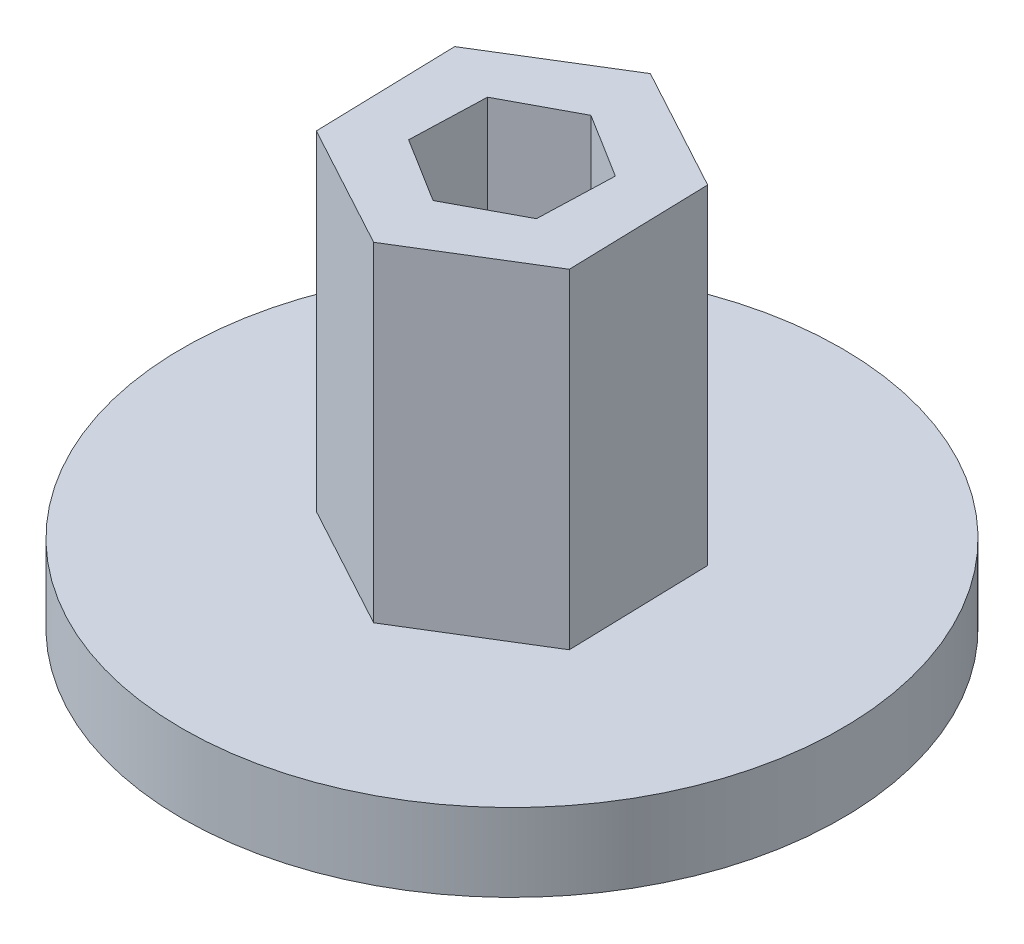
ISO-10303-21;
HEADER;
FILE_DESCRIPTION(('STEP AP214'),'2;1');
FILE_NAME('part.step','',(''),(''),'','','');
FILE_SCHEMA(('AUTOMOTIVE_DESIGN { 1 0 10303 214 1 1 1 1 }'));
ENDSEC;
DATA;
#1=APPLICATION_CONTEXT('core data for automotive mechanical design processes');
#2=APPLICATION_PROTOCOL_DEFINITION('international standard','automotive_design',2000,#1);
#3=PRODUCT_CONTEXT('',#1,'mechanical');
#4=PRODUCT('Part','Part','',(#3));
#5=PRODUCT_RELATED_PRODUCT_CATEGORY('part','',(#4));
#6=PRODUCT_DEFINITION_FORMATION('','',#4);
#7=PRODUCT_DEFINITION_CONTEXT('part definition',#1,'design');
#8=PRODUCT_DEFINITION('design','',#6,#7);
#9=PRODUCT_DEFINITION_SHAPE('','',#8);
#10=(LENGTH_UNIT() NAMED_UNIT(*) SI_UNIT(.MILLI.,.METRE.));
#11=(NAMED_UNIT(*) PLANE_ANGLE_UNIT() SI_UNIT($,.RADIAN.));
#12=(NAMED_UNIT(*) SI_UNIT($,.STERADIAN.) SOLID_ANGLE_UNIT());
#13=UNCERTAINTY_MEASURE_WITH_UNIT(LENGTH_MEASURE(1.E-05),#10,'distance_accuracy_value','');
#14=(GEOMETRIC_REPRESENTATION_CONTEXT(3) GLOBAL_UNCERTAINTY_ASSIGNED_CONTEXT((#13)) GLOBAL_UNIT_ASSIGNED_CONTEXT((#10,
#11,#12)) REPRESENTATION_CONTEXT('',''));
#15=CARTESIAN_POINT('',(0.,0.,0.));
#16=DIRECTION('',(0.,0.,1.));
#17=DIRECTION('',(1.,0.,0.));
#18=AXIS2_PLACEMENT_3D('',#15,#16,#17);
#19=CARTESIAN_POINT('',(0.,3.,0.));
#20=DIRECTION('',(0.,-1.,0.));
#21=DIRECTION('',(0.,0.,-1.));
#22=AXIS2_PLACEMENT_3D('',#19,#20,#21);
#23=CYLINDRICAL_SURFACE('',#22,12.7);
#24=CARTESIAN_POINT('',(0.,3.,0.));
#25=DIRECTION('',(0.,1.,0.));
#26=DIRECTION('',(0.,0.,1.));
#27=AXIS2_PLACEMENT_3D('',#24,#25,#26);
#28=CIRCLE('',#27,12.7);
#29=CARTESIAN_POINT('',(0.,3.,12.7));
#30=VERTEX_POINT('',#29);
#31=EDGE_CURVE('E11',#30,#30,#28,.T.);
#32=ORIENTED_EDGE('',*,*,#31,.F.);
#33=EDGE_LOOP('',(#32));
#34=FACE_BOUND('',#33,.T.);
#35=CARTESIAN_POINT('',(0.,0.,0.));
#36=DIRECTION('',(0.,1.,0.));
#37=DIRECTION('',(0.,0.,1.));
#38=AXIS2_PLACEMENT_3D('',#35,#36,#37);
#39=CIRCLE('',#38,12.7);
#40=CARTESIAN_POINT('',(0.,0.,12.7));
#41=VERTEX_POINT('',#40);
#42=EDGE_CURVE('E35',#41,#41,#39,.T.);
#43=ORIENTED_EDGE('',*,*,#42,.T.);
#44=EDGE_LOOP('',(#43));
#45=FACE_BOUND('',#44,.T.);
#46=ADVANCED_FACE('F32',(#34,#45),#23,.T.);
#47=CARTESIAN_POINT('',(0.,3.,0.));
#48=DIRECTION('',(0.,1.,0.));
#49=DIRECTION('',(0.,0.,1.));
#50=AXIS2_PLACEMENT_3D('',#47,#48,#49);
#51=PLANE('',#50);
#52=DIRECTION('',(0.879285702622515,0.,0.476294712508579));
#53=VECTOR('',#52,1.);
#54=CARTESIAN_POINT('',(-4.67137463720313,3.,2.86894178717555));
#55=LINE('',#54,#53);
#56=CARTESIAN_POINT('',(-4.67137463720313,3.,2.86894178717555));
#57=VERTEX_POINT('',#56);
#58=CARTESIAN_POINT('',(0.148889151071191,3.,5.48));
#59=VERTEX_POINT('',#58);
#60=EDGE_CURVE('E174',#57,#59,#55,.T.);
#61=ORIENTED_EDGE('',*,*,#60,.F.);
#62=DIRECTION('',(0.0271595305906223,0.,0.999631111909837));
#63=VECTOR('',#62,1.);
#64=CARTESIAN_POINT('',(-4.82026378827432,3.,-2.61105821282445));
#65=LINE('',#64,#63);
#66=CARTESIAN_POINT('',(-4.82026378827432,3.,-2.61105821282445));
#67=VERTEX_POINT('',#66);
#68=EDGE_CURVE('E179',#67,#57,#65,.T.);
#69=ORIENTED_EDGE('',*,*,#68,.F.);
#70=DIRECTION('',(-0.852126172031893,0.,0.523336399401258));
#71=VECTOR('',#70,1.);
#72=CARTESIAN_POINT('',(-0.148889151071195,3.,-5.48));
#73=LINE('',#72,#71);
#74=CARTESIAN_POINT('',(-0.148889151071195,3.,-5.48));
#75=VERTEX_POINT('',#74);
#76=EDGE_CURVE('E201',#75,#67,#73,.T.);
#77=ORIENTED_EDGE('',*,*,#76,.F.);
#78=DIRECTION('',(-0.879285702622515,0.,-0.476294712508579));
#79=VECTOR('',#78,1.);
#80=CARTESIAN_POINT('',(4.67137463720313,3.,-2.86894178717556));
#81=LINE('',#80,#79);
#82=CARTESIAN_POINT('',(4.67137463720313,3.,-2.86894178717556));
#83=VERTEX_POINT('',#82);
#84=EDGE_CURVE('E198',#83,#75,#81,.T.);
#85=ORIENTED_EDGE('',*,*,#84,.F.);
#86=DIRECTION('',(-0.0271595305906223,0.,-0.999631111909837));
#87=VECTOR('',#86,1.);
#88=CARTESIAN_POINT('',(4.82026378827432,3.,2.61105821282444));
#89=LINE('',#88,#87);
#90=CARTESIAN_POINT('',(4.82026378827432,3.,2.61105821282444));
#91=VERTEX_POINT('',#90);
#92=EDGE_CURVE('E195',#91,#83,#89,.T.);
#93=ORIENTED_EDGE('',*,*,#92,.F.);
#94=DIRECTION('',(0.852126172031893,0.,-0.523336399401258));
#95=VECTOR('',#94,1.);
#96=CARTESIAN_POINT('',(0.148889151071191,3.,5.48));
#97=LINE('',#96,#95);
#98=EDGE_CURVE('E192',#59,#91,#97,.T.);
#99=ORIENTED_EDGE('',*,*,#98,.F.);
#100=EDGE_LOOP('',(#61,#69,#77,#85,#93,#99));
#101=FACE_BOUND('',#100,.T.);
#102=ORIENTED_EDGE('',*,*,#31,.T.);
#103=EDGE_LOOP('',(#102));
#104=FACE_BOUND('',#103,.T.);
#105=ADVANCED_FACE('F231',(#101,#104),#51,.T.);
#106=CARTESIAN_POINT('',(0.,0.,0.));
#107=DIRECTION('',(0.,1.,0.));
#108=DIRECTION('',(0.,0.,1.));
#109=AXIS2_PLACEMENT_3D('',#106,#107,#108);
#110=PLANE('',#109);
#111=DIRECTION('',(-0.882282415438788,0.,0.470720447195039));
#112=VECTOR('',#111,1.);
#113=CARTESIAN_POINT('',(-1.20033714034735,0.,-2.24982015936891));
#114=LINE('',#113,#112);
#115=CARTESIAN_POINT('',(0.0985971342925371,0.,-2.94283513046676));
#116=VERTEX_POINT('',#115);
#117=CARTESIAN_POINT('',(-2.49927141498724,0.,-1.55680518827106));
#118=VERTEX_POINT('',#117);
#119=EDGE_CURVE('E168',#116,#118,#114,.T.);
#120=ORIENTED_EDGE('',*,*,#119,.T.);
#121=DIRECTION('',(-0.0334853423677184,0.,0.999439208679806));
#122=VECTOR('',#121,1.);
#123=CARTESIAN_POINT('',(-2.5485699821335,0.,-0.085387623037682));
#124=LINE('',#123,#122);
#125=CARTESIAN_POINT('',(-2.59786854927977,0.,1.3860299421957));
#126=VERTEX_POINT('',#125);
#127=EDGE_CURVE('E171',#118,#126,#124,.T.);
#128=ORIENTED_EDGE('',*,*,#127,.T.);
#129=DIRECTION('',(0.84879707307107,0.,0.528718761484766));
#130=VECTOR('',#129,1.);
#131=CARTESIAN_POINT('',(-1.34823284178615,0.,2.16443253633123));
#132=LINE('',#131,#130);
#133=CARTESIAN_POINT('',(-0.098597134292536,0.,2.94283513046676));
#134=VERTEX_POINT('',#133);
#135=EDGE_CURVE('E153',#126,#134,#132,.T.);
#136=ORIENTED_EDGE('',*,*,#135,.T.);
#137=DIRECTION('',(0.882282415438788,0.,-0.470720447195039));
#138=VECTOR('',#137,1.);
#139=CARTESIAN_POINT('',(1.20033714034735,0.,2.24982015936891));
#140=LINE('',#139,#138);
#141=CARTESIAN_POINT('',(2.49927141498724,0.,1.55680518827106));
#142=VERTEX_POINT('',#141);
#143=EDGE_CURVE('E126',#134,#142,#140,.T.);
#144=ORIENTED_EDGE('',*,*,#143,.T.);
#145=DIRECTION('',(0.0334853423677185,0.,-0.999439208679806));
#146=VECTOR('',#145,1.);
#147=CARTESIAN_POINT('',(2.54856998213351,0.,0.085387623037682));
#148=LINE('',#147,#146);
#149=CARTESIAN_POINT('',(2.59786854927977,0.,-1.3860299421957));
#150=VERTEX_POINT('',#149);
#151=EDGE_CURVE('E162',#142,#150,#148,.T.);
#152=ORIENTED_EDGE('',*,*,#151,.T.);
#153=DIRECTION('',(-0.848797073071069,0.,-0.528718761484767));
#154=VECTOR('',#153,1.);
#155=CARTESIAN_POINT('',(1.34823284178616,0.,-2.16443253633123));
#156=LINE('',#155,#154);
#157=EDGE_CURVE('E165',#150,#116,#156,.T.);
#158=ORIENTED_EDGE('',*,*,#157,.T.);
#159=EDGE_LOOP('',(#120,#128,#136,#144,#152,#158));
#160=FACE_BOUND('',#159,.T.);
#161=ORIENTED_EDGE('',*,*,#42,.F.);
#162=EDGE_LOOP('',(#161));
#163=FACE_BOUND('',#162,.T.);
#164=ADVANCED_FACE('F228',(#160,#163),#110,.F.);
#165=CARTESIAN_POINT('',(-4.67137463720313,15.7,2.86894178717555));
#166=DIRECTION('',(0.476294712508579,0.,-0.879285702622515));
#167=DIRECTION('',(-0.879285702622515,0.,-0.476294712508579));
#168=AXIS2_PLACEMENT_3D('',#165,#166,#167);
#169=PLANE('',#168);
#170=ORIENTED_EDGE('',*,*,#60,.T.);
#171=DIRECTION('',(0.,-1.,0.));
#172=VECTOR('',#171,1.);
#173=CARTESIAN_POINT('',(0.148889151071191,15.7,5.48));
#174=LINE('',#173,#172);
#175=CARTESIAN_POINT('',(0.148889151071191,15.7,5.48));
#176=VERTEX_POINT('',#175);
#177=EDGE_CURVE('E220',#176,#59,#174,.T.);
#178=ORIENTED_EDGE('',*,*,#177,.F.);
#179=DIRECTION('',(0.879285702622515,0.,0.476294712508579));
#180=VECTOR('',#179,1.);
#181=CARTESIAN_POINT('',(-4.67137463720313,15.7,2.86894178717555));
#182=LINE('',#181,#180);
#183=CARTESIAN_POINT('',(-4.67137463720313,15.7,2.86894178717555));
#184=VERTEX_POINT('',#183);
#185=EDGE_CURVE('E175',#184,#176,#182,.T.);
#186=ORIENTED_EDGE('',*,*,#185,.F.);
#187=DIRECTION('',(0.,-1.,0.));
#188=VECTOR('',#187,1.);
#189=CARTESIAN_POINT('',(-4.67137463720313,15.7,2.86894178717555));
#190=LINE('',#189,#188);
#191=EDGE_CURVE('E189',#184,#57,#190,.T.);
#192=ORIENTED_EDGE('',*,*,#191,.T.);
#193=EDGE_LOOP('',(#170,#178,#186,#192));
#194=FACE_BOUND('',#193,.T.);
#195=ADVANCED_FACE('F230',(#194),#169,.F.);
#196=CARTESIAN_POINT('',(0.148889151071191,15.7,5.48));
#197=DIRECTION('',(-0.523336399401258,0.,-0.852126172031893));
#198=DIRECTION('',(-0.852126172031893,0.,0.523336399401258));
#199=AXIS2_PLACEMENT_3D('',#196,#197,#198);
#200=PLANE('',#199);
#201=ORIENTED_EDGE('',*,*,#98,.T.);
#202=DIRECTION('',(0.,-1.,0.));
#203=VECTOR('',#202,1.);
#204=CARTESIAN_POINT('',(4.82026378827432,15.7,2.61105821282444));
#205=LINE('',#204,#203);
#206=CARTESIAN_POINT('',(4.82026378827432,15.7,2.61105821282444));
#207=VERTEX_POINT('',#206);
#208=EDGE_CURVE('E217',#207,#91,#205,.T.);
#209=ORIENTED_EDGE('',*,*,#208,.F.);
#210=DIRECTION('',(0.852126172031893,0.,-0.523336399401258));
#211=VECTOR('',#210,1.);
#212=CARTESIAN_POINT('',(0.148889151071191,15.7,5.48));
#213=LINE('',#212,#211);
#214=EDGE_CURVE('E178',#176,#207,#213,.T.);
#215=ORIENTED_EDGE('',*,*,#214,.F.);
#216=ORIENTED_EDGE('',*,*,#177,.T.);
#217=EDGE_LOOP('',(#201,#209,#215,#216));
#218=FACE_BOUND('',#217,.T.);
#219=ADVANCED_FACE('F237',(#218),#200,.F.);
#220=CARTESIAN_POINT('',(4.82026378827432,15.7,2.61105821282444));
#221=DIRECTION('',(-0.999631111909837,0.,0.0271595305906223));
#222=DIRECTION('',(0.0271595305906223,0.,0.999631111909837));
#223=AXIS2_PLACEMENT_3D('',#220,#221,#222);
#224=PLANE('',#223);
#225=ORIENTED_EDGE('',*,*,#92,.T.);
#226=DIRECTION('',(0.,-1.,0.));
#227=VECTOR('',#226,1.);
#228=CARTESIAN_POINT('',(4.67137463720313,15.7,-2.86894178717556));
#229=LINE('',#228,#227);
#230=CARTESIAN_POINT('',(4.67137463720313,15.7,-2.86894178717556));
#231=VERTEX_POINT('',#230);
#232=EDGE_CURVE('E214',#231,#83,#229,.T.);
#233=ORIENTED_EDGE('',*,*,#232,.F.);
#234=DIRECTION('',(-0.0271595305906223,0.,-0.999631111909837));
#235=VECTOR('',#234,1.);
#236=CARTESIAN_POINT('',(4.82026378827432,15.7,2.61105821282444));
#237=LINE('',#236,#235);
#238=EDGE_CURVE('E181',#207,#231,#237,.T.);
#239=ORIENTED_EDGE('',*,*,#238,.F.);
#240=ORIENTED_EDGE('',*,*,#208,.T.);
#241=EDGE_LOOP('',(#225,#233,#239,#240));
#242=FACE_BOUND('',#241,.T.);
#243=ADVANCED_FACE('F268',(#242),#224,.F.);
#244=CARTESIAN_POINT('',(4.67137463720313,15.7,-2.86894178717556));
#245=DIRECTION('',(-0.476294712508579,0.,0.879285702622515));
#246=DIRECTION('',(0.879285702622515,0.,0.476294712508579));
#247=AXIS2_PLACEMENT_3D('',#244,#245,#246);
#248=PLANE('',#247);
#249=ORIENTED_EDGE('',*,*,#84,.T.);
#250=DIRECTION('',(0.,-1.,0.));
#251=VECTOR('',#250,1.);
#252=CARTESIAN_POINT('',(-0.148889151071195,15.7,-5.48));
#253=LINE('',#252,#251);
#254=CARTESIAN_POINT('',(-0.148889151071195,15.7,-5.48));
#255=VERTEX_POINT('',#254);
#256=EDGE_CURVE('E211',#255,#75,#253,.T.);
#257=ORIENTED_EDGE('',*,*,#256,.F.);
#258=DIRECTION('',(-0.879285702622515,0.,-0.476294712508579));
#259=VECTOR('',#258,1.);
#260=CARTESIAN_POINT('',(4.67137463720313,15.7,-2.86894178717556));
#261=LINE('',#260,#259);
#262=EDGE_CURVE('E183',#231,#255,#261,.T.);
#263=ORIENTED_EDGE('',*,*,#262,.F.);
#264=ORIENTED_EDGE('',*,*,#232,.T.);
#265=EDGE_LOOP('',(#249,#257,#263,#264));
#266=FACE_BOUND('',#265,.T.);
#267=ADVANCED_FACE('F277',(#266),#248,.F.);
#268=CARTESIAN_POINT('',(-0.148889151071195,15.7,-5.48));
#269=DIRECTION('',(0.523336399401258,0.,0.852126172031893));
#270=DIRECTION('',(0.852126172031893,0.,-0.523336399401258));
#271=AXIS2_PLACEMENT_3D('',#268,#269,#270);
#272=PLANE('',#271);
#273=ORIENTED_EDGE('',*,*,#76,.T.);
#274=DIRECTION('',(0.,-1.,0.));
#275=VECTOR('',#274,1.);
#276=CARTESIAN_POINT('',(-4.82026378827432,15.7,-2.61105821282445));
#277=LINE('',#276,#275);
#278=CARTESIAN_POINT('',(-4.82026378827432,15.7,-2.61105821282445));
#279=VERTEX_POINT('',#278);
#280=EDGE_CURVE('E208',#279,#67,#277,.T.);
#281=ORIENTED_EDGE('',*,*,#280,.F.);
#282=DIRECTION('',(-0.852126172031893,0.,0.523336399401258));
#283=VECTOR('',#282,1.);
#284=CARTESIAN_POINT('',(-0.148889151071195,15.7,-5.48));
#285=LINE('',#284,#283);
#286=EDGE_CURVE('E185',#255,#279,#285,.T.);
#287=ORIENTED_EDGE('',*,*,#286,.F.);
#288=ORIENTED_EDGE('',*,*,#256,.T.);
#289=EDGE_LOOP('',(#273,#281,#287,#288));
#290=FACE_BOUND('',#289,.T.);
#291=ADVANCED_FACE('F287',(#290),#272,.F.);
#292=CARTESIAN_POINT('',(-4.82026378827432,15.7,-2.61105821282445));
#293=DIRECTION('',(0.999631111909837,0.,-0.0271595305906223));
#294=DIRECTION('',(-0.0271595305906223,0.,-0.999631111909837));
#295=AXIS2_PLACEMENT_3D('',#292,#293,#294);
#296=PLANE('',#295);
#297=ORIENTED_EDGE('',*,*,#68,.T.);
#298=ORIENTED_EDGE('',*,*,#191,.F.);
#299=DIRECTION('',(0.0271595305906223,0.,0.999631111909837));
#300=VECTOR('',#299,1.);
#301=CARTESIAN_POINT('',(-4.82026378827432,15.7,-2.61105821282445));
#302=LINE('',#301,#300);
#303=EDGE_CURVE('E187',#279,#184,#302,.T.);
#304=ORIENTED_EDGE('',*,*,#303,.F.);
#305=ORIENTED_EDGE('',*,*,#280,.T.);
#306=EDGE_LOOP('',(#297,#298,#304,#305));
#307=FACE_BOUND('',#306,.T.);
#308=ADVANCED_FACE('F297',(#307),#296,.F.);
#309=CARTESIAN_POINT('',(0.,15.7,0.));
#310=DIRECTION('',(0.,1.,0.));
#311=DIRECTION('',(0.,0.,1.));
#312=AXIS2_PLACEMENT_3D('',#309,#310,#311);
#313=PLANE('',#312);
#314=DIRECTION('',(-0.0334853423677184,0.,0.999439208679806));
#315=VECTOR('',#314,1.);
#316=CARTESIAN_POINT('',(-2.49927141498724,15.7,-1.55680518827106));
#317=LINE('',#316,#315);
#318=CARTESIAN_POINT('',(-2.49927141498724,15.7,-1.55680518827106));
#319=VERTEX_POINT('',#318);
#320=CARTESIAN_POINT('',(-2.59786854927977,15.7,1.3860299421957));
#321=VERTEX_POINT('',#320);
#322=EDGE_CURVE('E54',#319,#321,#317,.T.);
#323=ORIENTED_EDGE('',*,*,#322,.F.);
#324=DIRECTION('',(-0.882282415438788,0.,0.470720447195039));
#325=VECTOR('',#324,1.);
#326=CARTESIAN_POINT('',(0.0985971342925371,15.7,-2.94283513046676));
#327=LINE('',#326,#325);
#328=CARTESIAN_POINT('',(0.0985971342925371,15.7,-2.94283513046676));
#329=VERTEX_POINT('',#328);
#330=EDGE_CURVE('E148',#329,#319,#327,.T.);
#331=ORIENTED_EDGE('',*,*,#330,.F.);
#332=DIRECTION('',(-0.848797073071069,0.,-0.528718761484767));
#333=VECTOR('',#332,1.);
#334=CARTESIAN_POINT('',(2.59786854927977,15.7,-1.3860299421957));
#335=LINE('',#334,#333);
#336=CARTESIAN_POINT('',(2.59786854927977,15.7,-1.3860299421957));
#337=VERTEX_POINT('',#336);
#338=EDGE_CURVE('E142',#337,#329,#335,.T.);
#339=ORIENTED_EDGE('',*,*,#338,.F.);
#340=DIRECTION('',(0.0334853423677184,0.,-0.999439208679806));
#341=VECTOR('',#340,1.);
#342=CARTESIAN_POINT('',(2.49927141498724,15.7,1.55680518827106));
#343=LINE('',#342,#341);
#344=CARTESIAN_POINT('',(2.49927141498724,15.7,1.55680518827106));
#345=VERTEX_POINT('',#344);
#346=EDGE_CURVE('E140',#345,#337,#343,.T.);
#347=ORIENTED_EDGE('',*,*,#346,.F.);
#348=DIRECTION('',(0.882282415438788,0.,-0.470720447195039));
#349=VECTOR('',#348,1.);
#350=CARTESIAN_POINT('',(-0.098597134292536,15.7,2.94283513046676));
#351=LINE('',#350,#349);
#352=CARTESIAN_POINT('',(-0.098597134292536,15.7,2.94283513046676));
#353=VERTEX_POINT('',#352);
#354=EDGE_CURVE('E123',#353,#345,#351,.T.);
#355=ORIENTED_EDGE('',*,*,#354,.F.);
#356=DIRECTION('',(0.84879707307107,0.,0.528718761484766));
#357=VECTOR('',#356,1.);
#358=CARTESIAN_POINT('',(-2.59786854927977,15.7,1.3860299421957));
#359=LINE('',#358,#357);
#360=EDGE_CURVE('E132',#321,#353,#359,.T.);
#361=ORIENTED_EDGE('',*,*,#360,.F.);
#362=EDGE_LOOP('',(#323,#331,#339,#347,#355,#361));
#363=FACE_BOUND('',#362,.T.);
#364=ORIENTED_EDGE('',*,*,#185,.T.);
#365=ORIENTED_EDGE('',*,*,#214,.T.);
#366=ORIENTED_EDGE('',*,*,#238,.T.);
#367=ORIENTED_EDGE('',*,*,#262,.T.);
#368=ORIENTED_EDGE('',*,*,#286,.T.);
#369=ORIENTED_EDGE('',*,*,#303,.T.);
#370=EDGE_LOOP('',(#364,#365,#366,#367,#368,#369));
#371=FACE_BOUND('',#370,.T.);
#372=ADVANCED_FACE('F136',(#363,#371),#313,.T.);
#373=CARTESIAN_POINT('',(-2.49927141498724,-7.3,-1.55680518827106));
#374=DIRECTION('',(-0.999439208679806,0.,-0.0334853423677184));
#375=DIRECTION('',(-0.0334853423677184,0.,0.999439208679806));
#376=AXIS2_PLACEMENT_3D('',#373,#374,#375);
#377=PLANE('',#376);
#378=DIRECTION('',(0.,1.,0.));
#379=VECTOR('',#378,1.);
#380=CARTESIAN_POINT('',(-2.49927141498724,-7.3,-1.55680518827106));
#381=LINE('',#380,#379);
#382=EDGE_CURVE('E151',#118,#319,#381,.T.);
#383=ORIENTED_EDGE('',*,*,#382,.T.);
#384=ORIENTED_EDGE('',*,*,#322,.T.);
#385=DIRECTION('',(0.,1.,0.));
#386=VECTOR('',#385,1.);
#387=CARTESIAN_POINT('',(-2.59786854927977,-7.3,1.3860299421957));
#388=LINE('',#387,#386);
#389=EDGE_CURVE('E129',#126,#321,#388,.T.);
#390=ORIENTED_EDGE('',*,*,#389,.F.);
#391=ORIENTED_EDGE('',*,*,#127,.F.);
#392=EDGE_LOOP('',(#383,#384,#390,#391));
#393=FACE_BOUND('',#392,.T.);
#394=ADVANCED_FACE('F319',(#393),#377,.F.);
#395=CARTESIAN_POINT('',(0.0985971342925371,-7.3,-2.94283513046676));
#396=DIRECTION('',(-0.470720447195039,0.,-0.882282415438788));
#397=DIRECTION('',(-0.882282415438788,0.,0.470720447195039));
#398=AXIS2_PLACEMENT_3D('',#395,#396,#397);
#399=PLANE('',#398);
#400=DIRECTION('',(0.,1.,0.));
#401=VECTOR('',#400,1.);
#402=CARTESIAN_POINT('',(0.0985971342925371,-7.3,-2.94283513046676));
#403=LINE('',#402,#401);
#404=EDGE_CURVE('E154',#116,#329,#403,.T.);
#405=ORIENTED_EDGE('',*,*,#404,.T.);
#406=ORIENTED_EDGE('',*,*,#330,.T.);
#407=ORIENTED_EDGE('',*,*,#382,.F.);
#408=ORIENTED_EDGE('',*,*,#119,.F.);
#409=EDGE_LOOP('',(#405,#406,#407,#408));
#410=FACE_BOUND('',#409,.T.);
#411=ADVANCED_FACE('F328',(#410),#399,.F.);
#412=CARTESIAN_POINT('',(2.59786854927977,-7.3,-1.3860299421957));
#413=DIRECTION('',(0.528718761484767,0.,-0.84879707307107));
#414=DIRECTION('',(-0.848797073071069,0.,-0.528718761484767));
#415=AXIS2_PLACEMENT_3D('',#412,#413,#414);
#416=PLANE('',#415);
#417=DIRECTION('',(0.,1.,0.));
#418=VECTOR('',#417,1.);
#419=CARTESIAN_POINT('',(2.59786854927977,-7.3,-1.3860299421957));
#420=LINE('',#419,#418);
#421=EDGE_CURVE('E156',#150,#337,#420,.T.);
#422=ORIENTED_EDGE('',*,*,#421,.T.);
#423=ORIENTED_EDGE('',*,*,#338,.T.);
#424=ORIENTED_EDGE('',*,*,#404,.F.);
#425=ORIENTED_EDGE('',*,*,#157,.F.);
#426=EDGE_LOOP('',(#422,#423,#424,#425));
#427=FACE_BOUND('',#426,.T.);
#428=ADVANCED_FACE('F337',(#427),#416,.F.);
#429=CARTESIAN_POINT('',(2.49927141498724,-7.3,1.55680518827106));
#430=DIRECTION('',(0.999439208679806,0.,0.0334853423677184));
#431=DIRECTION('',(0.0334853423677185,0.,-0.999439208679806));
#432=AXIS2_PLACEMENT_3D('',#429,#430,#431);
#433=PLANE('',#432);
#434=DIRECTION('',(0.,1.,0.));
#435=VECTOR('',#434,1.);
#436=CARTESIAN_POINT('',(2.49927141498724,-7.3,1.55680518827106));
#437=LINE('',#436,#435);
#438=EDGE_CURVE('E128',#142,#345,#437,.T.);
#439=ORIENTED_EDGE('',*,*,#438,.T.);
#440=ORIENTED_EDGE('',*,*,#346,.T.);
#441=ORIENTED_EDGE('',*,*,#421,.F.);
#442=ORIENTED_EDGE('',*,*,#151,.F.);
#443=EDGE_LOOP('',(#439,#440,#441,#442));
#444=FACE_BOUND('',#443,.T.);
#445=ADVANCED_FACE('F347',(#444),#433,.F.);
#446=CARTESIAN_POINT('',(-0.098597134292536,-7.3,2.94283513046676));
#447=DIRECTION('',(0.470720447195039,0.,0.882282415438788));
#448=DIRECTION('',(0.882282415438788,0.,-0.470720447195039));
#449=AXIS2_PLACEMENT_3D('',#446,#447,#448);
#450=PLANE('',#449);
#451=DIRECTION('',(0.,1.,0.));
#452=VECTOR('',#451,1.);
#453=CARTESIAN_POINT('',(-0.098597134292536,-7.3,2.94283513046676));
#454=LINE('',#453,#452);
#455=EDGE_CURVE('E46',#134,#353,#454,.T.);
#456=ORIENTED_EDGE('',*,*,#455,.T.);
#457=ORIENTED_EDGE('',*,*,#354,.T.);
#458=ORIENTED_EDGE('',*,*,#438,.F.);
#459=ORIENTED_EDGE('',*,*,#143,.F.);
#460=EDGE_LOOP('',(#456,#457,#458,#459));
#461=FACE_BOUND('',#460,.T.);
#462=ADVANCED_FACE('F120',(#461),#450,.F.);
#463=CARTESIAN_POINT('',(-2.59786854927977,-7.3,1.3860299421957));
#464=DIRECTION('',(-0.528718761484766,0.,0.84879707307107));
#465=DIRECTION('',(0.84879707307107,0.,0.528718761484766));
#466=AXIS2_PLACEMENT_3D('',#463,#464,#465);
#467=PLANE('',#466);
#468=ORIENTED_EDGE('',*,*,#389,.T.);
#469=ORIENTED_EDGE('',*,*,#360,.T.);
#470=ORIENTED_EDGE('',*,*,#455,.F.);
#471=ORIENTED_EDGE('',*,*,#135,.F.);
#472=EDGE_LOOP('',(#468,#469,#470,#471));
#473=FACE_BOUND('',#472,.T.);
#474=ADVANCED_FACE('F133',(#473),#467,.F.);
#475=CLOSED_SHELL('',(#46,#105,#164,#195,#219,#243,#267,#291,#308,#372,#394,#411,#428,#445,#462,#474));
#476=MANIFOLD_SOLID_BREP('B2',#475);
#477=ADVANCED_BREP_SHAPE_REPRESENTATION('',(#18,#476),#14);
#478=SHAPE_DEFINITION_REPRESENTATION(#9,#477);
ENDSEC;
END-ISO-10303-21;
